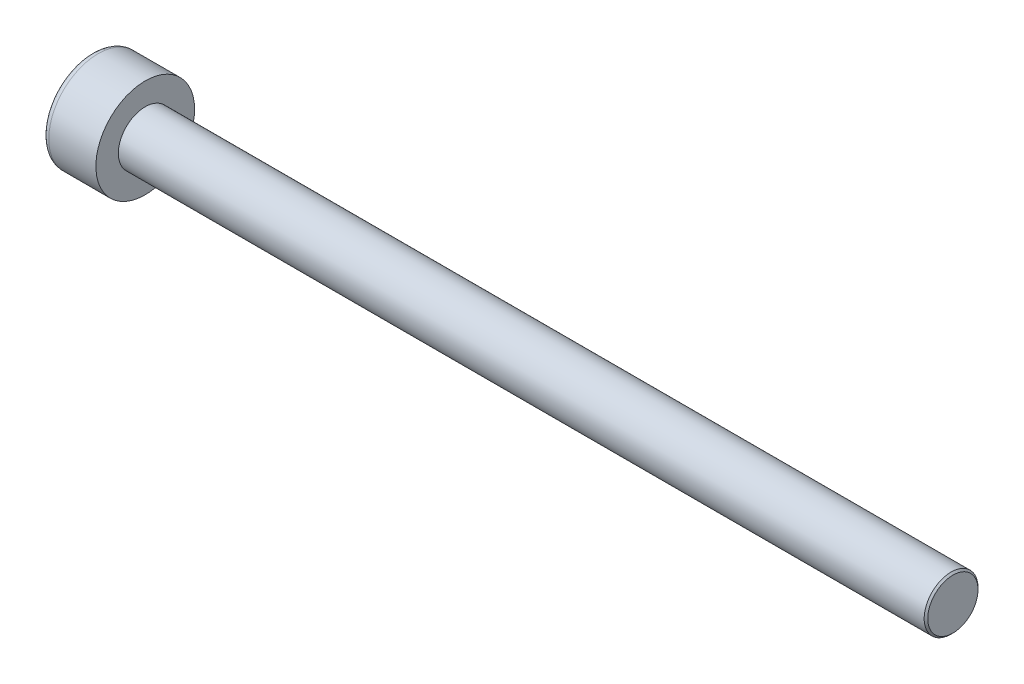
ISO-10303-21;
HEADER;
FILE_DESCRIPTION(('STEP AP214'),'2;1');
FILE_NAME('part.step','',(''),(''),'','','');
FILE_SCHEMA(('AUTOMOTIVE_DESIGN { 1 0 10303 214 1 1 1 1 }'));
ENDSEC;
DATA;
#1=APPLICATION_CONTEXT('core data for automotive mechanical design processes');
#2=APPLICATION_PROTOCOL_DEFINITION('international standard','automotive_design',2000,#1);
#3=PRODUCT_CONTEXT('',#1,'mechanical');
#4=PRODUCT('Part','Part','',(#3));
#5=PRODUCT_RELATED_PRODUCT_CATEGORY('part','',(#4));
#6=PRODUCT_DEFINITION_FORMATION('','',#4);
#7=PRODUCT_DEFINITION_CONTEXT('part definition',#1,'design');
#8=PRODUCT_DEFINITION('design','',#6,#7);
#9=PRODUCT_DEFINITION_SHAPE('','',#8);
#10=(LENGTH_UNIT() NAMED_UNIT(*) SI_UNIT(.MILLI.,.METRE.));
#11=(NAMED_UNIT(*) PLANE_ANGLE_UNIT() SI_UNIT($,.RADIAN.));
#12=(NAMED_UNIT(*) SI_UNIT($,.STERADIAN.) SOLID_ANGLE_UNIT());
#13=UNCERTAINTY_MEASURE_WITH_UNIT(LENGTH_MEASURE(1.E-05),#10,'distance_accuracy_value','');
#14=(GEOMETRIC_REPRESENTATION_CONTEXT(3) GLOBAL_UNCERTAINTY_ASSIGNED_CONTEXT((#13)) GLOBAL_UNIT_ASSIGNED_CONTEXT((#10,
#11,#12)) REPRESENTATION_CONTEXT('',''));
#15=CARTESIAN_POINT('',(0.,0.,0.));
#16=DIRECTION('',(0.,0.,1.));
#17=DIRECTION('',(1.,0.,0.));
#18=AXIS2_PLACEMENT_3D('',#15,#16,#17);
#19=CARTESIAN_POINT('',(1.3,-1.25,0.721687836487031));
#20=DIRECTION('',(0.,1.,0.));
#21=DIRECTION('',(1.,0.,0.));
#22=AXIS2_PLACEMENT_3D('',#19,#20,#21);
#23=PLANE('',#22);
#24=DIRECTION('',(0.,0.,-1.));
#25=VECTOR('',#24,1.);
#26=CARTESIAN_POINT('',(0.,-1.25,0.721687836487031));
#27=LINE('',#26,#25);
#28=CARTESIAN_POINT('',(0.,-1.25,0.721687836487031));
#29=VERTEX_POINT('',#28);
#30=CARTESIAN_POINT('',(0.,-1.25,-0.721687836487035));
#31=VERTEX_POINT('',#30);
#32=EDGE_CURVE('E225',#29,#31,#27,.T.);
#33=ORIENTED_EDGE('',*,*,#32,.F.);
#34=DIRECTION('',(-1.,0.,0.));
#35=VECTOR('',#34,1.);
#36=CARTESIAN_POINT('',(1.3,-1.25,0.721687836487031));
#37=LINE('',#36,#35);
#38=CARTESIAN_POINT('',(1.3,-1.25,0.721687836487031));
#39=VERTEX_POINT('',#38);
#40=EDGE_CURVE('E11',#39,#29,#37,.T.);
#41=ORIENTED_EDGE('',*,*,#40,.F.);
#42=DIRECTION('',(0.,0.,-1.));
#43=VECTOR('',#42,1.);
#44=CARTESIAN_POINT('',(1.3,-1.25,0.721687836487031));
#45=LINE('',#44,#43);
#46=CARTESIAN_POINT('',(1.3,-1.25,0.));
#47=VERTEX_POINT('',#46);
#48=EDGE_CURVE('E224',#39,#47,#45,.T.);
#49=ORIENTED_EDGE('',*,*,#48,.T.);
#50=DIRECTION('',(0.,0.,-1.));
#51=VECTOR('',#50,1.);
#52=CARTESIAN_POINT('',(1.3,-1.25,0.721687836487031));
#53=LINE('',#52,#51);
#54=CARTESIAN_POINT('',(1.3,-1.25,-0.721687836487035));
#55=VERTEX_POINT('',#54);
#56=EDGE_CURVE('E192',#47,#55,#53,.T.);
#57=ORIENTED_EDGE('',*,*,#56,.T.);
#58=DIRECTION('',(-1.,0.,0.));
#59=VECTOR('',#58,1.);
#60=CARTESIAN_POINT('',(1.3,-1.25,-0.721687836487035));
#61=LINE('',#60,#59);
#62=EDGE_CURVE('E171',#55,#31,#61,.T.);
#63=ORIENTED_EDGE('',*,*,#62,.T.);
#64=EDGE_LOOP('',(#33,#41,#49,#57,#63));
#65=FACE_BOUND('',#64,.T.);
#66=ADVANCED_FACE('F17',(#65),#23,.T.);
#67=CARTESIAN_POINT('',(1.3,0.,1.44337567297406));
#68=DIRECTION('',(0.,0.5,-0.866025403784439));
#69=DIRECTION('',(-1.,0.,0.));
#70=AXIS2_PLACEMENT_3D('',#67,#68,#69);
#71=PLANE('',#70);
#72=DIRECTION('',(0.,-0.866025403784439,-0.5));
#73=VECTOR('',#72,1.);
#74=CARTESIAN_POINT('',(0.,0.,1.44337567297406));
#75=LINE('',#74,#73);
#76=CARTESIAN_POINT('',(0.,0.,1.44337567297406));
#77=VERTEX_POINT('',#76);
#78=EDGE_CURVE('E229',#77,#29,#75,.T.);
#79=ORIENTED_EDGE('',*,*,#78,.F.);
#80=DIRECTION('',(-1.,0.,0.));
#81=VECTOR('',#80,1.);
#82=CARTESIAN_POINT('',(1.3,0.,1.44337567297406));
#83=LINE('',#82,#81);
#84=CARTESIAN_POINT('',(1.3,0.,1.44337567297406));
#85=VERTEX_POINT('',#84);
#86=EDGE_CURVE('E28',#85,#77,#83,.T.);
#87=ORIENTED_EDGE('',*,*,#86,.F.);
#88=DIRECTION('',(0.,-0.866025403784439,-0.5));
#89=VECTOR('',#88,1.);
#90=CARTESIAN_POINT('',(1.3,0.,1.44337567297406));
#91=LINE('',#90,#89);
#92=CARTESIAN_POINT('',(1.3,-0.625,1.08253175473055));
#93=VERTEX_POINT('',#92);
#94=EDGE_CURVE('E207',#85,#93,#91,.T.);
#95=ORIENTED_EDGE('',*,*,#94,.T.);
#96=DIRECTION('',(0.,-0.866025403784439,-0.5));
#97=VECTOR('',#96,1.);
#98=CARTESIAN_POINT('',(1.3,0.,1.44337567297406));
#99=LINE('',#98,#97);
#100=EDGE_CURVE('E244',#93,#39,#99,.T.);
#101=ORIENTED_EDGE('',*,*,#100,.T.);
#102=ORIENTED_EDGE('',*,*,#40,.T.);
#103=EDGE_LOOP('',(#79,#87,#95,#101,#102));
#104=FACE_BOUND('',#103,.T.);
#105=ADVANCED_FACE('F358',(#104),#71,.T.);
#106=CARTESIAN_POINT('',(1.3,1.25,0.721687836487032));
#107=DIRECTION('',(0.,-0.5,-0.866025403784439));
#108=DIRECTION('',(0.,-0.866025403784439,0.5));
#109=AXIS2_PLACEMENT_3D('',#106,#107,#108);
#110=PLANE('',#109);
#111=DIRECTION('',(0.,-0.866025403784439,0.5));
#112=VECTOR('',#111,1.);
#113=CARTESIAN_POINT('',(0.,1.25,0.721687836487032));
#114=LINE('',#113,#112);
#115=CARTESIAN_POINT('',(0.,1.25,0.721687836487032));
#116=VERTEX_POINT('',#115);
#117=EDGE_CURVE('E253',#116,#77,#114,.T.);
#118=ORIENTED_EDGE('',*,*,#117,.F.);
#119=DIRECTION('',(-1.,0.,0.));
#120=VECTOR('',#119,1.);
#121=CARTESIAN_POINT('',(1.3,1.25,0.721687836487032));
#122=LINE('',#121,#120);
#123=CARTESIAN_POINT('',(1.3,1.25,0.721687836487032));
#124=VERTEX_POINT('',#123);
#125=EDGE_CURVE('E215',#124,#116,#122,.T.);
#126=ORIENTED_EDGE('',*,*,#125,.F.);
#127=DIRECTION('',(0.,-0.866025403784439,0.5));
#128=VECTOR('',#127,1.);
#129=CARTESIAN_POINT('',(1.3,1.25,0.721687836487032));
#130=LINE('',#129,#128);
#131=CARTESIAN_POINT('',(1.3,0.625,1.08253175473055));
#132=VERTEX_POINT('',#131);
#133=EDGE_CURVE('E249',#124,#132,#130,.T.);
#134=ORIENTED_EDGE('',*,*,#133,.T.);
#135=DIRECTION('',(0.,-0.866025403784439,0.5));
#136=VECTOR('',#135,1.);
#137=CARTESIAN_POINT('',(1.3,1.25,0.721687836487032));
#138=LINE('',#137,#136);
#139=EDGE_CURVE('E212',#132,#85,#138,.T.);
#140=ORIENTED_EDGE('',*,*,#139,.T.);
#141=ORIENTED_EDGE('',*,*,#86,.T.);
#142=EDGE_LOOP('',(#118,#126,#134,#140,#141));
#143=FACE_BOUND('',#142,.T.);
#144=ADVANCED_FACE('F363',(#143),#110,.T.);
#145=CARTESIAN_POINT('',(1.3,1.25,-0.721687836487031));
#146=DIRECTION('',(0.,-1.,0.));
#147=DIRECTION('',(0.,0.,-1.));
#148=AXIS2_PLACEMENT_3D('',#145,#146,#147);
#149=PLANE('',#148);
#150=DIRECTION('',(0.,0.,1.));
#151=VECTOR('',#150,1.);
#152=CARTESIAN_POINT('',(0.,1.25,-0.721687836487031));
#153=LINE('',#152,#151);
#154=CARTESIAN_POINT('',(0.,1.25,-0.721687836487031));
#155=VERTEX_POINT('',#154);
#156=EDGE_CURVE('E252',#155,#116,#153,.T.);
#157=ORIENTED_EDGE('',*,*,#156,.F.);
#158=DIRECTION('',(-1.,0.,0.));
#159=VECTOR('',#158,1.);
#160=CARTESIAN_POINT('',(1.3,1.25,-0.721687836487031));
#161=LINE('',#160,#159);
#162=CARTESIAN_POINT('',(1.3,1.25,-0.721687836487031));
#163=VERTEX_POINT('',#162);
#164=EDGE_CURVE('E150',#163,#155,#161,.T.);
#165=ORIENTED_EDGE('',*,*,#164,.F.);
#166=DIRECTION('',(0.,0.,1.));
#167=VECTOR('',#166,1.);
#168=CARTESIAN_POINT('',(1.3,1.25,-0.721687836487031));
#169=LINE('',#168,#167);
#170=CARTESIAN_POINT('',(1.3,1.25,0.));
#171=VERTEX_POINT('',#170);
#172=EDGE_CURVE('E276',#163,#171,#169,.T.);
#173=ORIENTED_EDGE('',*,*,#172,.T.);
#174=DIRECTION('',(0.,0.,1.));
#175=VECTOR('',#174,1.);
#176=CARTESIAN_POINT('',(1.3,1.25,-0.721687836487031));
#177=LINE('',#176,#175);
#178=EDGE_CURVE('E278',#171,#124,#177,.T.);
#179=ORIENTED_EDGE('',*,*,#178,.T.);
#180=ORIENTED_EDGE('',*,*,#125,.T.);
#181=EDGE_LOOP('',(#157,#165,#173,#179,#180));
#182=FACE_BOUND('',#181,.T.);
#183=ADVANCED_FACE('F319',(#182),#149,.T.);
#184=CARTESIAN_POINT('',(1.3,0.,-1.44337567297406));
#185=DIRECTION('',(0.,-0.5,0.866025403784439));
#186=DIRECTION('',(-1.,0.,0.));
#187=AXIS2_PLACEMENT_3D('',#184,#185,#186);
#188=PLANE('',#187);
#189=DIRECTION('',(0.,0.866025403784439,0.5));
#190=VECTOR('',#189,1.);
#191=CARTESIAN_POINT('',(0.,0.,-1.44337567297406));
#192=LINE('',#191,#190);
#193=CARTESIAN_POINT('',(0.,0.,-1.44337567297406));
#194=VERTEX_POINT('',#193);
#195=EDGE_CURVE('E165',#194,#155,#192,.T.);
#196=ORIENTED_EDGE('',*,*,#195,.F.);
#197=DIRECTION('',(-1.,0.,0.));
#198=VECTOR('',#197,1.);
#199=CARTESIAN_POINT('',(1.3,0.,-1.44337567297406));
#200=LINE('',#199,#198);
#201=CARTESIAN_POINT('',(1.3,0.,-1.44337567297406));
#202=VERTEX_POINT('',#201);
#203=EDGE_CURVE('E158',#202,#194,#200,.T.);
#204=ORIENTED_EDGE('',*,*,#203,.F.);
#205=DIRECTION('',(0.,0.866025403784439,0.5));
#206=VECTOR('',#205,1.);
#207=CARTESIAN_POINT('',(1.3,0.,-1.44337567297406));
#208=LINE('',#207,#206);
#209=CARTESIAN_POINT('',(1.3,0.625,-1.08253175473055));
#210=VERTEX_POINT('',#209);
#211=EDGE_CURVE('E162',#202,#210,#208,.T.);
#212=ORIENTED_EDGE('',*,*,#211,.T.);
#213=DIRECTION('',(0.,0.866025403784439,0.5));
#214=VECTOR('',#213,1.);
#215=CARTESIAN_POINT('',(1.3,0.,-1.44337567297406));
#216=LINE('',#215,#214);
#217=EDGE_CURVE('E181',#210,#163,#216,.T.);
#218=ORIENTED_EDGE('',*,*,#217,.T.);
#219=ORIENTED_EDGE('',*,*,#164,.T.);
#220=EDGE_LOOP('',(#196,#204,#212,#218,#219));
#221=FACE_BOUND('',#220,.T.);
#222=ADVANCED_FACE('F160',(#221),#188,.T.);
#223=CARTESIAN_POINT('',(1.3,-1.25,-0.721687836487035));
#224=DIRECTION('',(0.,0.5,0.866025403784439));
#225=DIRECTION('',(1.,0.,0.));
#226=AXIS2_PLACEMENT_3D('',#223,#224,#225);
#227=PLANE('',#226);
#228=DIRECTION('',(0.,0.866025403784439,-0.5));
#229=VECTOR('',#228,1.);
#230=CARTESIAN_POINT('',(0.,-1.25,-0.721687836487035));
#231=LINE('',#230,#229);
#232=EDGE_CURVE('E211',#31,#194,#231,.T.);
#233=ORIENTED_EDGE('',*,*,#232,.F.);
#234=ORIENTED_EDGE('',*,*,#62,.F.);
#235=DIRECTION('',(0.,0.866025403784439,-0.5));
#236=VECTOR('',#235,1.);
#237=CARTESIAN_POINT('',(1.3,-1.25,-0.721687836487035));
#238=LINE('',#237,#236);
#239=CARTESIAN_POINT('',(1.3,-0.625,-1.08253175473055));
#240=VERTEX_POINT('',#239);
#241=EDGE_CURVE('E185',#55,#240,#238,.T.);
#242=ORIENTED_EDGE('',*,*,#241,.T.);
#243=DIRECTION('',(0.,0.866025403784439,-0.5));
#244=VECTOR('',#243,1.);
#245=CARTESIAN_POINT('',(1.3,-1.25,-0.721687836487035));
#246=LINE('',#245,#244);
#247=EDGE_CURVE('E176',#240,#202,#246,.T.);
#248=ORIENTED_EDGE('',*,*,#247,.T.);
#249=ORIENTED_EDGE('',*,*,#203,.T.);
#250=EDGE_LOOP('',(#233,#234,#242,#248,#249));
#251=FACE_BOUND('',#250,.T.);
#252=ADVANCED_FACE('F183',(#251),#227,.T.);
#253=CARTESIAN_POINT('',(48.,0.,0.));
#254=DIRECTION('',(1.,0.,0.));
#255=DIRECTION('',(0.,1.,0.));
#256=AXIS2_PLACEMENT_3D('',#253,#254,#255);
#257=PLANE('',#256);
#258=CARTESIAN_POINT('',(48.,0.,0.));
#259=DIRECTION('',(1.,0.,0.));
#260=DIRECTION('',(0.,0.,-1.));
#261=AXIS2_PLACEMENT_3D('',#258,#259,#260);
#262=CIRCLE('',#261,1.4);
#263=CARTESIAN_POINT('',(48.,0.,-1.4));
#264=VERTEX_POINT('',#263);
#265=EDGE_CURVE('E234',#264,#264,#262,.T.);
#266=ORIENTED_EDGE('',*,*,#265,.T.);
#267=EDGE_LOOP('',(#266));
#268=FACE_BOUND('',#267,.T.);
#269=ADVANCED_FACE('F345',(#268),#257,.T.);
#270=CARTESIAN_POINT('',(3.,0.,0.));
#271=DIRECTION('',(1.,0.,0.));
#272=DIRECTION('',(0.,1.,0.));
#273=AXIS2_PLACEMENT_3D('',#270,#271,#272);
#274=PLANE('',#273);
#275=CARTESIAN_POINT('',(3.,0.,0.));
#276=DIRECTION('',(1.,0.,0.));
#277=DIRECTION('',(0.,0.,-1.));
#278=AXIS2_PLACEMENT_3D('',#275,#276,#277);
#279=CIRCLE('',#278,1.5);
#280=CARTESIAN_POINT('',(3.,0.,-1.5));
#281=VERTEX_POINT('',#280);
#282=EDGE_CURVE('E304',#281,#281,#279,.T.);
#283=ORIENTED_EDGE('',*,*,#282,.F.);
#284=EDGE_LOOP('',(#283));
#285=FACE_BOUND('',#284,.T.);
#286=CARTESIAN_POINT('',(3.,0.,0.));
#287=DIRECTION('',(1.,0.,0.));
#288=DIRECTION('',(0.,0.,-1.));
#289=AXIS2_PLACEMENT_3D('',#286,#287,#288);
#290=CIRCLE('',#289,2.75);
#291=CARTESIAN_POINT('',(3.,0.,-2.75));
#292=VERTEX_POINT('',#291);
#293=EDGE_CURVE('E241',#292,#292,#290,.T.);
#294=ORIENTED_EDGE('',*,*,#293,.T.);
#295=EDGE_LOOP('',(#294));
#296=FACE_BOUND('',#295,.T.);
#297=ADVANCED_FACE('F347',(#285,#296),#274,.T.);
#298=CARTESIAN_POINT('',(0.,0.,0.));
#299=DIRECTION('',(1.,0.,0.));
#300=DIRECTION('',(0.,1.,0.));
#301=AXIS2_PLACEMENT_3D('',#298,#299,#300);
#302=PLANE('',#301);
#303=ORIENTED_EDGE('',*,*,#232,.T.);
#304=ORIENTED_EDGE('',*,*,#195,.T.);
#305=ORIENTED_EDGE('',*,*,#156,.T.);
#306=ORIENTED_EDGE('',*,*,#117,.T.);
#307=ORIENTED_EDGE('',*,*,#78,.T.);
#308=ORIENTED_EDGE('',*,*,#32,.T.);
#309=EDGE_LOOP('',(#303,#304,#305,#306,#307,#308));
#310=FACE_BOUND('',#309,.T.);
#311=CARTESIAN_POINT('',(0.,0.,0.));
#312=DIRECTION('',(-1.,0.,0.));
#313=DIRECTION('',(0.,0.,-1.));
#314=AXIS2_PLACEMENT_3D('',#311,#312,#313);
#315=CIRCLE('',#314,2.375);
#316=CARTESIAN_POINT('',(0.,0.,2.375));
#317=VERTEX_POINT('',#316);
#318=EDGE_CURVE('E103',#317,#317,#315,.T.);
#319=ORIENTED_EDGE('',*,*,#318,.T.);
#320=EDGE_LOOP('',(#319));
#321=FACE_BOUND('',#320,.T.);
#322=ADVANCED_FACE('F283',(#310,#321),#302,.F.);
#323=CARTESIAN_POINT('',(1.3,-2.5,0.));
#324=DIRECTION('',(-1.,0.,0.));
#325=DIRECTION('',(0.,0.,1.));
#326=AXIS2_PLACEMENT_3D('',#323,#324,#325);
#327=PLANE('',#326);
#328=ORIENTED_EDGE('',*,*,#139,.F.);
#329=CARTESIAN_POINT('',(1.3,0.,0.));
#330=DIRECTION('',(1.,0.,0.));
#331=DIRECTION('',(0.,0.,1.));
#332=AXIS2_PLACEMENT_3D('',#329,#330,#331);
#333=CIRCLE('',#332,1.25);
#334=EDGE_CURVE('E206',#132,#93,#333,.T.);
#335=ORIENTED_EDGE('',*,*,#334,.T.);
#336=ORIENTED_EDGE('',*,*,#94,.F.);
#337=EDGE_LOOP('',(#328,#335,#336));
#338=FACE_BOUND('',#337,.T.);
#339=ADVANCED_FACE('F391',(#338),#327,.T.);
#340=CARTESIAN_POINT('',(1.3,-2.5,0.));
#341=DIRECTION('',(-1.,0.,0.));
#342=DIRECTION('',(0.,0.,1.));
#343=AXIS2_PLACEMENT_3D('',#340,#341,#342);
#344=PLANE('',#343);
#345=ORIENTED_EDGE('',*,*,#178,.F.);
#346=CARTESIAN_POINT('',(1.3,0.,0.));
#347=DIRECTION('',(1.,0.,0.));
#348=DIRECTION('',(0.,0.,1.));
#349=AXIS2_PLACEMENT_3D('',#346,#347,#348);
#350=CIRCLE('',#349,1.25);
#351=EDGE_CURVE('E240',#171,#132,#350,.T.);
#352=ORIENTED_EDGE('',*,*,#351,.T.);
#353=ORIENTED_EDGE('',*,*,#133,.F.);
#354=EDGE_LOOP('',(#345,#352,#353));
#355=FACE_BOUND('',#354,.T.);
#356=ADVANCED_FACE('F326',(#355),#344,.T.);
#357=CARTESIAN_POINT('',(1.3,-2.5,0.));
#358=DIRECTION('',(-1.,0.,0.));
#359=DIRECTION('',(0.,0.,1.));
#360=AXIS2_PLACEMENT_3D('',#357,#358,#359);
#361=PLANE('',#360);
#362=ORIENTED_EDGE('',*,*,#217,.F.);
#363=CARTESIAN_POINT('',(1.3,0.,0.));
#364=DIRECTION('',(1.,0.,0.));
#365=DIRECTION('',(0.,0.,-1.));
#366=AXIS2_PLACEMENT_3D('',#363,#364,#365);
#367=CIRCLE('',#366,1.25);
#368=EDGE_CURVE('E236',#210,#171,#367,.T.);
#369=ORIENTED_EDGE('',*,*,#368,.T.);
#370=ORIENTED_EDGE('',*,*,#172,.F.);
#371=EDGE_LOOP('',(#362,#369,#370));
#372=FACE_BOUND('',#371,.T.);
#373=ADVANCED_FACE('F317',(#372),#361,.T.);
#374=CARTESIAN_POINT('',(1.3,-2.5,0.));
#375=DIRECTION('',(-1.,0.,0.));
#376=DIRECTION('',(0.,0.,1.));
#377=AXIS2_PLACEMENT_3D('',#374,#375,#376);
#378=PLANE('',#377);
#379=ORIENTED_EDGE('',*,*,#247,.F.);
#380=CARTESIAN_POINT('',(1.3,0.,0.));
#381=DIRECTION('',(1.,0.,0.));
#382=DIRECTION('',(0.,0.,1.));
#383=AXIS2_PLACEMENT_3D('',#380,#381,#382);
#384=CIRCLE('',#383,1.25);
#385=CARTESIAN_POINT('',(1.3,0.,-1.25));
#386=VERTEX_POINT('',#385);
#387=EDGE_CURVE('E195',#240,#386,#384,.T.);
#388=ORIENTED_EDGE('',*,*,#387,.T.);
#389=CARTESIAN_POINT('',(1.3,0.,0.));
#390=DIRECTION('',(1.,0.,0.));
#391=DIRECTION('',(0.,0.,1.));
#392=AXIS2_PLACEMENT_3D('',#389,#390,#391);
#393=CIRCLE('',#392,1.25);
#394=EDGE_CURVE('E178',#386,#210,#393,.T.);
#395=ORIENTED_EDGE('',*,*,#394,.T.);
#396=ORIENTED_EDGE('',*,*,#211,.F.);
#397=EDGE_LOOP('',(#379,#388,#395,#396));
#398=FACE_BOUND('',#397,.T.);
#399=ADVANCED_FACE('F174',(#398),#378,.T.);
#400=CARTESIAN_POINT('',(1.3,-2.5,0.));
#401=DIRECTION('',(-1.,0.,0.));
#402=DIRECTION('',(0.,0.,1.));
#403=AXIS2_PLACEMENT_3D('',#400,#401,#402);
#404=PLANE('',#403);
#405=ORIENTED_EDGE('',*,*,#56,.F.);
#406=CARTESIAN_POINT('',(1.3,0.,0.));
#407=DIRECTION('',(1.,0.,0.));
#408=DIRECTION('',(0.,0.,1.));
#409=AXIS2_PLACEMENT_3D('',#406,#407,#408);
#410=CIRCLE('',#409,1.25);
#411=EDGE_CURVE('E21',#47,#240,#410,.T.);
#412=ORIENTED_EDGE('',*,*,#411,.T.);
#413=ORIENTED_EDGE('',*,*,#241,.F.);
#414=EDGE_LOOP('',(#405,#412,#413));
#415=FACE_BOUND('',#414,.T.);
#416=ADVANCED_FACE('F287',(#415),#404,.T.);
#417=CARTESIAN_POINT('',(1.3,-2.5,0.));
#418=DIRECTION('',(-1.,0.,0.));
#419=DIRECTION('',(0.,0.,1.));
#420=AXIS2_PLACEMENT_3D('',#417,#418,#419);
#421=PLANE('',#420);
#422=ORIENTED_EDGE('',*,*,#100,.F.);
#423=CARTESIAN_POINT('',(1.3,0.,0.));
#424=DIRECTION('',(1.,0.,0.));
#425=DIRECTION('',(0.,0.,1.));
#426=AXIS2_PLACEMENT_3D('',#423,#424,#425);
#427=CIRCLE('',#426,1.25);
#428=EDGE_CURVE('E202',#93,#47,#427,.T.);
#429=ORIENTED_EDGE('',*,*,#428,.T.);
#430=ORIENTED_EDGE('',*,*,#48,.F.);
#431=EDGE_LOOP('',(#422,#429,#430));
#432=FACE_BOUND('',#431,.T.);
#433=ADVANCED_FACE('F294',(#432),#421,.T.);
#434=CARTESIAN_POINT('',(3.,0.,0.));
#435=DIRECTION('',(-1.,0.,0.));
#436=DIRECTION('',(0.,0.,1.));
#437=AXIS2_PLACEMENT_3D('',#434,#435,#436);
#438=CYLINDRICAL_SURFACE('',#437,2.75);
#439=CARTESIAN_POINT('',(0.375,0.,0.));
#440=DIRECTION('',(1.,0.,0.));
#441=DIRECTION('',(0.,0.,-1.));
#442=AXIS2_PLACEMENT_3D('',#439,#440,#441);
#443=CIRCLE('',#442,2.75);
#444=CARTESIAN_POINT('',(0.375,0.,-2.75));
#445=VERTEX_POINT('',#444);
#446=CARTESIAN_POINT('',(0.375,0.,2.75));
#447=VERTEX_POINT('',#446);
#448=EDGE_CURVE('E220',#445,#447,#443,.T.);
#449=ORIENTED_EDGE('',*,*,#448,.T.);
#450=CARTESIAN_POINT('',(0.375,0.,0.));
#451=DIRECTION('',(1.,0.,0.));
#452=DIRECTION('',(0.,0.,-1.));
#453=AXIS2_PLACEMENT_3D('',#450,#451,#452);
#454=CIRCLE('',#453,2.75);
#455=EDGE_CURVE('E216',#447,#445,#454,.T.);
#456=ORIENTED_EDGE('',*,*,#455,.T.);
#457=DIRECTION('',(1.,0.,0.));
#458=VECTOR('',#457,1.);
#459=CARTESIAN_POINT('',(3.,0.,-2.75));
#460=LINE('',#459,#458);
#461=EDGE_CURVE('E245',#445,#292,#460,.T.);
#462=ORIENTED_EDGE('',*,*,#461,.T.);
#463=ORIENTED_EDGE('',*,*,#293,.F.);
#464=ORIENTED_EDGE('',*,*,#461,.F.);
#465=EDGE_LOOP('',(#449,#456,#462,#463,#464));
#466=FACE_BOUND('',#465,.T.);
#467=ADVANCED_FACE('F19',(#466),#438,.T.);
#468=CARTESIAN_POINT('',(11.,0.,0.));
#469=DIRECTION('',(-1.,0.,0.));
#470=DIRECTION('',(0.,0.,1.));
#471=AXIS2_PLACEMENT_3D('',#468,#469,#470);
#472=CYLINDRICAL_SURFACE('',#471,1.5);
#473=ORIENTED_EDGE('',*,*,#282,.T.);
#474=DIRECTION('',(1.,0.,0.));
#475=VECTOR('',#474,1.);
#476=CARTESIAN_POINT('',(11.,0.,-1.5));
#477=LINE('',#476,#475);
#478=CARTESIAN_POINT('',(47.9,0.,-1.5));
#479=VERTEX_POINT('',#478);
#480=EDGE_CURVE('E260',#281,#479,#477,.T.);
#481=ORIENTED_EDGE('',*,*,#480,.T.);
#482=CARTESIAN_POINT('',(47.9,0.,0.));
#483=DIRECTION('',(-1.,0.,0.));
#484=DIRECTION('',(0.,0.,-1.));
#485=AXIS2_PLACEMENT_3D('',#482,#483,#484);
#486=CIRCLE('',#485,1.5);
#487=EDGE_CURVE('E235',#479,#479,#486,.T.);
#488=ORIENTED_EDGE('',*,*,#487,.T.);
#489=ORIENTED_EDGE('',*,*,#480,.F.);
#490=EDGE_LOOP('',(#473,#481,#488,#489));
#491=FACE_BOUND('',#490,.T.);
#492=ADVANCED_FACE('F339',(#491),#472,.T.);
#493=CARTESIAN_POINT('',(1.3,0.,0.));
#494=DIRECTION('',(-1.,0.,0.));
#495=DIRECTION('',(0.,0.,1.));
#496=AXIS2_PLACEMENT_3D('',#493,#494,#495);
#497=CONICAL_SURFACE('',#496,1.25,1.0471975511966);
#498=DIRECTION('',(-0.5,0.,-0.866025403784438));
#499=VECTOR('',#498,1.);
#500=CARTESIAN_POINT('',(1.3,0.,-1.25));
#501=LINE('',#500,#499);
#502=CARTESIAN_POINT('',(2.02168783648704,0.,0.));
#503=VERTEX_POINT('',#502);
#504=EDGE_CURVE('E198',#503,#386,#501,.T.);
#505=ORIENTED_EDGE('',*,*,#504,.T.);
#506=ORIENTED_EDGE('',*,*,#387,.F.);
#507=ORIENTED_EDGE('',*,*,#411,.F.);
#508=ORIENTED_EDGE('',*,*,#428,.F.);
#509=ORIENTED_EDGE('',*,*,#334,.F.);
#510=ORIENTED_EDGE('',*,*,#351,.F.);
#511=ORIENTED_EDGE('',*,*,#368,.F.);
#512=ORIENTED_EDGE('',*,*,#394,.F.);
#513=ORIENTED_EDGE('',*,*,#504,.F.);
#514=EDGE_LOOP('',(#505,#506,#507,#508,#509,#510,#511,#512,#513));
#515=FACE_BOUND('',#514,.T.);
#516=ADVANCED_FACE('F297',(#515),#497,.F.);
#517=CARTESIAN_POINT('',(0.375,0.,0.));
#518=DIRECTION('',(1.,0.,0.));
#519=DIRECTION('',(0.,0.,-1.));
#520=AXIS2_PLACEMENT_3D('',#517,#518,#519);
#521=TOROIDAL_SURFACE('',#520,2.375,0.375);
#522=ORIENTED_EDGE('',*,*,#448,.F.);
#523=ORIENTED_EDGE('',*,*,#455,.F.);
#524=CARTESIAN_POINT('',(0.375,0.,2.375));
#525=DIRECTION('',(0.,-1.,0.));
#526=DIRECTION('',(0.,0.,1.));
#527=AXIS2_PLACEMENT_3D('',#524,#525,#526);
#528=CIRCLE('',#527,0.375);
#529=EDGE_CURVE('E116',#447,#317,#528,.T.);
#530=ORIENTED_EDGE('',*,*,#529,.T.);
#531=ORIENTED_EDGE('',*,*,#318,.F.);
#532=ORIENTED_EDGE('',*,*,#529,.F.);
#533=EDGE_LOOP('',(#522,#523,#530,#531,#532));
#534=FACE_BOUND('',#533,.T.);
#535=ADVANCED_FACE('F374',(#534),#521,.T.);
#536=CARTESIAN_POINT('',(48.,0.,0.));
#537=DIRECTION('',(-1.,0.,0.));
#538=DIRECTION('',(0.,0.,1.));
#539=AXIS2_PLACEMENT_3D('',#536,#537,#538);
#540=CONICAL_SURFACE('',#539,1.4,0.785398163397452);
#541=ORIENTED_EDGE('',*,*,#487,.F.);
#542=DIRECTION('',(0.707106781186545,0.,0.70710678118655));
#543=VECTOR('',#542,1.);
#544=CARTESIAN_POINT('',(48.,0.,-1.4));
#545=LINE('',#544,#543);
#546=EDGE_CURVE('E230',#479,#264,#545,.T.);
#547=ORIENTED_EDGE('',*,*,#546,.T.);
#548=ORIENTED_EDGE('',*,*,#265,.F.);
#549=ORIENTED_EDGE('',*,*,#546,.F.);
#550=EDGE_LOOP('',(#541,#547,#548,#549));
#551=FACE_BOUND('',#550,.T.);
#552=ADVANCED_FACE('F342',(#551),#540,.T.);
#553=CLOSED_SHELL('',(#66,#105,#144,#183,#222,#252,#269,#297,#322,#339,#356,#373,#399,#416,#433,
#467,#492,#516,#535,#552));
#554=MANIFOLD_SOLID_BREP('B1',#553);
#555=ADVANCED_BREP_SHAPE_REPRESENTATION('',(#18,#554),#14);
#556=SHAPE_DEFINITION_REPRESENTATION(#9,#555);
ENDSEC;
END-ISO-10303-21;
